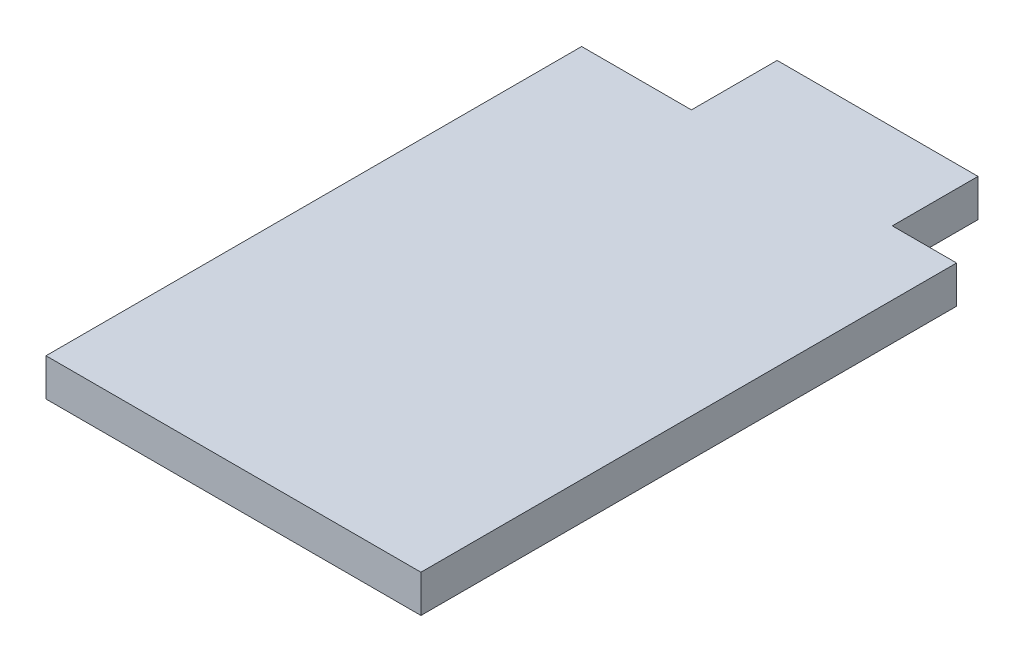
ISO-10303-21;
HEADER;
FILE_DESCRIPTION(('STEP AP214'),'2;1');
FILE_NAME('part.step','',(''),(''),'','','');
FILE_SCHEMA(('AUTOMOTIVE_DESIGN { 1 0 10303 214 1 1 1 1 }'));
ENDSEC;
DATA;
#1=APPLICATION_CONTEXT('core data for automotive mechanical design processes');
#2=APPLICATION_PROTOCOL_DEFINITION('international standard','automotive_design',2000,#1);
#3=PRODUCT_CONTEXT('',#1,'mechanical');
#4=PRODUCT('Part','Part','',(#3));
#5=PRODUCT_RELATED_PRODUCT_CATEGORY('part','',(#4));
#6=PRODUCT_DEFINITION_FORMATION('','',#4);
#7=PRODUCT_DEFINITION_CONTEXT('part definition',#1,'design');
#8=PRODUCT_DEFINITION('design','',#6,#7);
#9=PRODUCT_DEFINITION_SHAPE('','',#8);
#10=(LENGTH_UNIT() NAMED_UNIT(*) SI_UNIT(.MILLI.,.METRE.));
#11=(NAMED_UNIT(*) PLANE_ANGLE_UNIT() SI_UNIT($,.RADIAN.));
#12=(NAMED_UNIT(*) SI_UNIT($,.STERADIAN.) SOLID_ANGLE_UNIT());
#13=UNCERTAINTY_MEASURE_WITH_UNIT(LENGTH_MEASURE(1.E-05),#10,'distance_accuracy_value','');
#14=(GEOMETRIC_REPRESENTATION_CONTEXT(3) GLOBAL_UNCERTAINTY_ASSIGNED_CONTEXT((#13)) GLOBAL_UNIT_ASSIGNED_CONTEXT((#10,
#11,#12)) REPRESENTATION_CONTEXT('',''));
#15=CARTESIAN_POINT('',(0.,0.,0.));
#16=DIRECTION('',(0.,0.,1.));
#17=DIRECTION('',(1.,0.,0.));
#18=AXIS2_PLACEMENT_3D('',#15,#16,#17);
#19=CARTESIAN_POINT('',(-35.,7.,-50.));
#20=DIRECTION('',(0.,0.,1.));
#21=DIRECTION('',(1.,0.,0.));
#22=AXIS2_PLACEMENT_3D('',#19,#20,#21);
#23=PLANE('',#22);
#24=DIRECTION('',(0.,-1.,0.));
#25=VECTOR('',#24,1.);
#26=CARTESIAN_POINT('',(23.,7.,-50.));
#27=LINE('',#26,#25);
#28=CARTESIAN_POINT('',(23.,7.,-50.));
#29=VERTEX_POINT('',#28);
#30=CARTESIAN_POINT('',(23.,0.,-50.));
#31=VERTEX_POINT('',#30);
#32=EDGE_CURVE('E135',#29,#31,#27,.T.);
#33=ORIENTED_EDGE('',*,*,#32,.F.);
#34=DIRECTION('',(-1.,0.,0.));
#35=VECTOR('',#34,1.);
#36=CARTESIAN_POINT('',(-35.,7.,-50.));
#37=LINE('',#36,#35);
#38=CARTESIAN_POINT('',(35.,7.,-50.));
#39=VERTEX_POINT('',#38);
#40=EDGE_CURVE('E85',#39,#29,#37,.T.);
#41=ORIENTED_EDGE('',*,*,#40,.F.);
#42=DIRECTION('',(0.,-1.,0.));
#43=VECTOR('',#42,1.);
#44=CARTESIAN_POINT('',(35.,7.,-50.));
#45=LINE('',#44,#43);
#46=CARTESIAN_POINT('',(35.,0.,-50.));
#47=VERTEX_POINT('',#46);
#48=EDGE_CURVE('E11',#39,#47,#45,.T.);
#49=ORIENTED_EDGE('',*,*,#48,.T.);
#50=DIRECTION('',(-1.,0.,0.));
#51=VECTOR('',#50,1.);
#52=CARTESIAN_POINT('',(-35.,0.,-50.));
#53=LINE('',#52,#51);
#54=EDGE_CURVE('E184',#47,#31,#53,.T.);
#55=ORIENTED_EDGE('',*,*,#54,.T.);
#56=EDGE_LOOP('',(#33,#41,#49,#55));
#57=FACE_BOUND('',#56,.T.);
#58=ADVANCED_FACE('F31',(#57),#23,.F.);
#59=CARTESIAN_POINT('',(35.,7.,50.));
#60=DIRECTION('',(-1.,0.,0.));
#61=DIRECTION('',(0.,0.,1.));
#62=AXIS2_PLACEMENT_3D('',#59,#60,#61);
#63=PLANE('',#62);
#64=DIRECTION('',(0.,0.,-1.));
#65=VECTOR('',#64,1.);
#66=CARTESIAN_POINT('',(35.,0.,50.));
#67=LINE('',#66,#65);
#68=CARTESIAN_POINT('',(35.,0.,50.));
#69=VERTEX_POINT('',#68);
#70=EDGE_CURVE('E166',#69,#47,#67,.T.);
#71=ORIENTED_EDGE('',*,*,#70,.T.);
#72=ORIENTED_EDGE('',*,*,#48,.F.);
#73=DIRECTION('',(0.,0.,-1.));
#74=VECTOR('',#73,1.);
#75=CARTESIAN_POINT('',(35.,7.,50.));
#76=LINE('',#75,#74);
#77=CARTESIAN_POINT('',(35.,7.,50.));
#78=VERTEX_POINT('',#77);
#79=EDGE_CURVE('E169',#78,#39,#76,.T.);
#80=ORIENTED_EDGE('',*,*,#79,.F.);
#81=DIRECTION('',(0.,-1.,0.));
#82=VECTOR('',#81,1.);
#83=CARTESIAN_POINT('',(35.,7.,50.));
#84=LINE('',#83,#82);
#85=EDGE_CURVE('E192',#78,#69,#84,.T.);
#86=ORIENTED_EDGE('',*,*,#85,.T.);
#87=EDGE_LOOP('',(#71,#72,#80,#86));
#88=FACE_BOUND('',#87,.T.);
#89=ADVANCED_FACE('F33',(#88),#63,.F.);
#90=CARTESIAN_POINT('',(-14.5,7.,-50.));
#91=VERTEX_POINT('',#90);
#92=CARTESIAN_POINT('',(-35.,7.,-50.));
#93=VERTEX_POINT('',#92);
#94=EDGE_CURVE('E171',#91,#93,#37,.T.);
#95=ORIENTED_EDGE('',*,*,#94,.F.);
#96=DIRECTION('',(0.,-1.,0.));
#97=VECTOR('',#96,1.);
#98=CARTESIAN_POINT('',(-14.5,7.,-50.));
#99=LINE('',#98,#97);
#100=CARTESIAN_POINT('',(-14.5,0.,-50.));
#101=VERTEX_POINT('',#100);
#102=EDGE_CURVE('E125',#91,#101,#99,.T.);
#103=ORIENTED_EDGE('',*,*,#102,.T.);
#104=CARTESIAN_POINT('',(-35.,0.,-50.));
#105=VERTEX_POINT('',#104);
#106=EDGE_CURVE('E181',#101,#105,#53,.T.);
#107=ORIENTED_EDGE('',*,*,#106,.T.);
#108=DIRECTION('',(0.,-1.,0.));
#109=VECTOR('',#108,1.);
#110=CARTESIAN_POINT('',(-35.,7.,-50.));
#111=LINE('',#110,#109);
#112=EDGE_CURVE('E40',#93,#105,#111,.T.);
#113=ORIENTED_EDGE('',*,*,#112,.F.);
#114=EDGE_LOOP('',(#95,#103,#107,#113));
#115=FACE_BOUND('',#114,.T.);
#116=ADVANCED_FACE('F214',(#115),#23,.F.);
#117=CARTESIAN_POINT('',(-35.,7.,50.));
#118=DIRECTION('',(1.,0.,0.));
#119=DIRECTION('',(0.,0.,-1.));
#120=AXIS2_PLACEMENT_3D('',#117,#118,#119);
#121=PLANE('',#120);
#122=DIRECTION('',(0.,0.,1.));
#123=VECTOR('',#122,1.);
#124=CARTESIAN_POINT('',(-35.,0.,50.));
#125=LINE('',#124,#123);
#126=CARTESIAN_POINT('',(-35.,0.,50.));
#127=VERTEX_POINT('',#126);
#128=EDGE_CURVE('E188',#105,#127,#125,.T.);
#129=ORIENTED_EDGE('',*,*,#128,.T.);
#130=DIRECTION('',(0.,-1.,0.));
#131=VECTOR('',#130,1.);
#132=CARTESIAN_POINT('',(-35.,7.,50.));
#133=LINE('',#132,#131);
#134=CARTESIAN_POINT('',(-35.,7.,50.));
#135=VERTEX_POINT('',#134);
#136=EDGE_CURVE('E194',#135,#127,#133,.T.);
#137=ORIENTED_EDGE('',*,*,#136,.F.);
#138=DIRECTION('',(0.,0.,1.));
#139=VECTOR('',#138,1.);
#140=CARTESIAN_POINT('',(-35.,7.,50.));
#141=LINE('',#140,#139);
#142=EDGE_CURVE('E174',#93,#135,#141,.T.);
#143=ORIENTED_EDGE('',*,*,#142,.F.);
#144=ORIENTED_EDGE('',*,*,#112,.T.);
#145=EDGE_LOOP('',(#129,#137,#143,#144));
#146=FACE_BOUND('',#145,.T.);
#147=ADVANCED_FACE('F201',(#146),#121,.F.);
#148=CARTESIAN_POINT('',(-35.,7.,50.));
#149=DIRECTION('',(0.,0.,-1.));
#150=DIRECTION('',(-1.,0.,0.));
#151=AXIS2_PLACEMENT_3D('',#148,#149,#150);
#152=PLANE('',#151);
#153=DIRECTION('',(1.,0.,0.));
#154=VECTOR('',#153,1.);
#155=CARTESIAN_POINT('',(-35.,0.,50.));
#156=LINE('',#155,#154);
#157=EDGE_CURVE('E78',#127,#69,#156,.T.);
#158=ORIENTED_EDGE('',*,*,#157,.T.);
#159=ORIENTED_EDGE('',*,*,#85,.F.);
#160=DIRECTION('',(1.,0.,0.));
#161=VECTOR('',#160,1.);
#162=CARTESIAN_POINT('',(-35.,7.,50.));
#163=LINE('',#162,#161);
#164=EDGE_CURVE('E57',#135,#78,#163,.T.);
#165=ORIENTED_EDGE('',*,*,#164,.F.);
#166=ORIENTED_EDGE('',*,*,#136,.T.);
#167=EDGE_LOOP('',(#158,#159,#165,#166));
#168=FACE_BOUND('',#167,.T.);
#169=ADVANCED_FACE('F213',(#168),#152,.F.);
#170=CARTESIAN_POINT('',(35.,7.,-50.));
#171=DIRECTION('',(0.,-1.,0.));
#172=DIRECTION('',(0.,0.,-1.));
#173=AXIS2_PLACEMENT_3D('',#170,#171,#172);
#174=PLANE('',#173);
#175=ORIENTED_EDGE('',*,*,#79,.T.);
#176=ORIENTED_EDGE('',*,*,#40,.T.);
#177=DIRECTION('',(0.,0.,1.));
#178=VECTOR('',#177,1.);
#179=CARTESIAN_POINT('',(23.,7.,-50.));
#180=LINE('',#179,#178);
#181=CARTESIAN_POINT('',(23.,7.,-66.));
#182=VERTEX_POINT('',#181);
#183=EDGE_CURVE('E116',#182,#29,#180,.T.);
#184=ORIENTED_EDGE('',*,*,#183,.F.);
#185=DIRECTION('',(1.,0.,0.));
#186=VECTOR('',#185,1.);
#187=CARTESIAN_POINT('',(-14.5,7.,-66.));
#188=LINE('',#187,#186);
#189=CARTESIAN_POINT('',(-14.5,7.,-66.));
#190=VERTEX_POINT('',#189);
#191=EDGE_CURVE('E111',#190,#182,#188,.T.);
#192=ORIENTED_EDGE('',*,*,#191,.F.);
#193=DIRECTION('',(0.,0.,-1.));
#194=VECTOR('',#193,1.);
#195=CARTESIAN_POINT('',(-14.5,7.,-50.));
#196=LINE('',#195,#194);
#197=EDGE_CURVE('E121',#91,#190,#196,.T.);
#198=ORIENTED_EDGE('',*,*,#197,.F.);
#199=ORIENTED_EDGE('',*,*,#94,.T.);
#200=ORIENTED_EDGE('',*,*,#142,.T.);
#201=ORIENTED_EDGE('',*,*,#164,.T.);
#202=EDGE_LOOP('',(#175,#176,#184,#192,#198,#199,#200,#201));
#203=FACE_BOUND('',#202,.T.);
#204=ADVANCED_FACE('F120',(#203),#174,.F.);
#205=CARTESIAN_POINT('',(35.,0.,-50.));
#206=DIRECTION('',(0.,-1.,0.));
#207=DIRECTION('',(0.,0.,-1.));
#208=AXIS2_PLACEMENT_3D('',#205,#206,#207);
#209=PLANE('',#208);
#210=CARTESIAN_POINT('',(30.5,0.,-36.5));
#211=DIRECTION('',(0.,-1.,0.));
#212=DIRECTION('',(0.,0.,-1.));
#213=AXIS2_PLACEMENT_3D('',#210,#211,#212);
#214=CIRCLE('',#213,1.5);
#215=CARTESIAN_POINT('',(30.5,0.,-38.));
#216=VERTEX_POINT('',#215);
#217=EDGE_CURVE('E148',#216,#216,#214,.T.);
#218=ORIENTED_EDGE('',*,*,#217,.F.);
#219=EDGE_LOOP('',(#218));
#220=FACE_BOUND('',#219,.T.);
#221=CARTESIAN_POINT('',(30.5,0.,39.5));
#222=DIRECTION('',(0.,-1.,0.));
#223=DIRECTION('',(0.,0.,-1.));
#224=AXIS2_PLACEMENT_3D('',#221,#222,#223);
#225=CIRCLE('',#224,1.5);
#226=CARTESIAN_POINT('',(30.5,0.,38.));
#227=VERTEX_POINT('',#226);
#228=EDGE_CURVE('E147',#227,#227,#225,.T.);
#229=ORIENTED_EDGE('',*,*,#228,.F.);
#230=EDGE_LOOP('',(#229));
#231=FACE_BOUND('',#230,.T.);
#232=CARTESIAN_POINT('',(-30.5,0.,39.5));
#233=DIRECTION('',(0.,-1.,0.));
#234=DIRECTION('',(0.,0.,-1.));
#235=AXIS2_PLACEMENT_3D('',#232,#233,#234);
#236=CIRCLE('',#235,1.5);
#237=CARTESIAN_POINT('',(-30.5,0.,38.));
#238=VERTEX_POINT('',#237);
#239=EDGE_CURVE('E154',#238,#238,#236,.T.);
#240=ORIENTED_EDGE('',*,*,#239,.F.);
#241=EDGE_LOOP('',(#240));
#242=FACE_BOUND('',#241,.T.);
#243=CARTESIAN_POINT('',(-30.5,0.,-36.5));
#244=DIRECTION('',(0.,-1.,0.));
#245=DIRECTION('',(0.,0.,-1.));
#246=AXIS2_PLACEMENT_3D('',#243,#244,#245);
#247=CIRCLE('',#246,1.5);
#248=CARTESIAN_POINT('',(-30.5,0.,-38.));
#249=VERTEX_POINT('',#248);
#250=EDGE_CURVE('E160',#249,#249,#247,.T.);
#251=ORIENTED_EDGE('',*,*,#250,.F.);
#252=EDGE_LOOP('',(#251));
#253=FACE_BOUND('',#252,.T.);
#254=ORIENTED_EDGE('',*,*,#70,.F.);
#255=ORIENTED_EDGE('',*,*,#157,.F.);
#256=ORIENTED_EDGE('',*,*,#128,.F.);
#257=ORIENTED_EDGE('',*,*,#106,.F.);
#258=DIRECTION('',(0.,0.,-1.));
#259=VECTOR('',#258,1.);
#260=CARTESIAN_POINT('',(-14.5,0.,-50.));
#261=LINE('',#260,#259);
#262=CARTESIAN_POINT('',(-14.5,0.,-66.));
#263=VERTEX_POINT('',#262);
#264=EDGE_CURVE('E48',#101,#263,#261,.T.);
#265=ORIENTED_EDGE('',*,*,#264,.T.);
#266=DIRECTION('',(1.,0.,0.));
#267=VECTOR('',#266,1.);
#268=CARTESIAN_POINT('',(-14.5,0.,-66.));
#269=LINE('',#268,#267);
#270=CARTESIAN_POINT('',(23.,0.,-66.));
#271=VERTEX_POINT('',#270);
#272=EDGE_CURVE('E113',#263,#271,#269,.T.);
#273=ORIENTED_EDGE('',*,*,#272,.T.);
#274=DIRECTION('',(0.,0.,1.));
#275=VECTOR('',#274,1.);
#276=CARTESIAN_POINT('',(23.,0.,-50.));
#277=LINE('',#276,#275);
#278=EDGE_CURVE('E126',#271,#31,#277,.T.);
#279=ORIENTED_EDGE('',*,*,#278,.T.);
#280=ORIENTED_EDGE('',*,*,#54,.F.);
#281=EDGE_LOOP('',(#254,#255,#256,#257,#265,#273,#279,#280));
#282=FACE_BOUND('',#281,.T.);
#283=ADVANCED_FACE('F207',(#220,#231,#242,#253,#282),#209,.T.);
#284=CARTESIAN_POINT('',(-30.5,5.,-36.5));
#285=DIRECTION('',(0.,-1.,0.));
#286=DIRECTION('',(0.,0.,-1.));
#287=AXIS2_PLACEMENT_3D('',#284,#285,#286);
#288=CYLINDRICAL_SURFACE('',#287,1.5);
#289=CARTESIAN_POINT('',(-30.5,5.,-36.5));
#290=DIRECTION('',(0.,-1.,0.));
#291=DIRECTION('',(0.,0.,-1.));
#292=AXIS2_PLACEMENT_3D('',#289,#290,#291);
#293=CIRCLE('',#292,1.5);
#294=CARTESIAN_POINT('',(-30.5,5.,-38.));
#295=VERTEX_POINT('',#294);
#296=EDGE_CURVE('E163',#295,#295,#293,.T.);
#297=ORIENTED_EDGE('',*,*,#296,.F.);
#298=EDGE_LOOP('',(#297));
#299=FACE_BOUND('',#298,.T.);
#300=ORIENTED_EDGE('',*,*,#250,.T.);
#301=EDGE_LOOP('',(#300));
#302=FACE_BOUND('',#301,.T.);
#303=ADVANCED_FACE('F266',(#299,#302),#288,.F.);
#304=CARTESIAN_POINT('',(-30.5,5.,-36.5));
#305=DIRECTION('',(0.,-1.,0.));
#306=DIRECTION('',(0.,0.,-1.));
#307=AXIS2_PLACEMENT_3D('',#304,#305,#306);
#308=PLANE('',#307);
#309=ORIENTED_EDGE('',*,*,#296,.T.);
#310=EDGE_LOOP('',(#309));
#311=FACE_BOUND('',#310,.T.);
#312=ADVANCED_FACE('F262',(#311),#308,.T.);
#313=CARTESIAN_POINT('',(-30.5,5.,39.5));
#314=DIRECTION('',(0.,-1.,0.));
#315=DIRECTION('',(0.,0.,-1.));
#316=AXIS2_PLACEMENT_3D('',#313,#314,#315);
#317=CYLINDRICAL_SURFACE('',#316,1.5);
#318=CARTESIAN_POINT('',(-30.5,5.,39.5));
#319=DIRECTION('',(0.,-1.,0.));
#320=DIRECTION('',(0.,0.,-1.));
#321=AXIS2_PLACEMENT_3D('',#318,#319,#320);
#322=CIRCLE('',#321,1.5);
#323=CARTESIAN_POINT('',(-30.5,5.,38.));
#324=VERTEX_POINT('',#323);
#325=EDGE_CURVE('E157',#324,#324,#322,.T.);
#326=ORIENTED_EDGE('',*,*,#325,.F.);
#327=EDGE_LOOP('',(#326));
#328=FACE_BOUND('',#327,.T.);
#329=ORIENTED_EDGE('',*,*,#239,.T.);
#330=EDGE_LOOP('',(#329));
#331=FACE_BOUND('',#330,.T.);
#332=ADVANCED_FACE('F258',(#328,#331),#317,.F.);
#333=CARTESIAN_POINT('',(-30.5,5.,39.5));
#334=DIRECTION('',(0.,-1.,0.));
#335=DIRECTION('',(0.,0.,-1.));
#336=AXIS2_PLACEMENT_3D('',#333,#334,#335);
#337=PLANE('',#336);
#338=ORIENTED_EDGE('',*,*,#325,.T.);
#339=EDGE_LOOP('',(#338));
#340=FACE_BOUND('',#339,.T.);
#341=ADVANCED_FACE('F254',(#340),#337,.T.);
#342=CARTESIAN_POINT('',(30.5,5.,39.5));
#343=DIRECTION('',(0.,-1.,0.));
#344=DIRECTION('',(0.,0.,-1.));
#345=AXIS2_PLACEMENT_3D('',#342,#343,#344);
#346=CYLINDRICAL_SURFACE('',#345,1.5);
#347=CARTESIAN_POINT('',(30.5,5.,39.5));
#348=DIRECTION('',(0.,-1.,0.));
#349=DIRECTION('',(0.,0.,-1.));
#350=AXIS2_PLACEMENT_3D('',#347,#348,#349);
#351=CIRCLE('',#350,1.5);
#352=CARTESIAN_POINT('',(30.5,5.,38.));
#353=VERTEX_POINT('',#352);
#354=EDGE_CURVE('E151',#353,#353,#351,.T.);
#355=ORIENTED_EDGE('',*,*,#354,.F.);
#356=EDGE_LOOP('',(#355));
#357=FACE_BOUND('',#356,.T.);
#358=ORIENTED_EDGE('',*,*,#228,.T.);
#359=EDGE_LOOP('',(#358));
#360=FACE_BOUND('',#359,.T.);
#361=ADVANCED_FACE('F250',(#357,#360),#346,.F.);
#362=CARTESIAN_POINT('',(30.5,5.,39.5));
#363=DIRECTION('',(0.,-1.,0.));
#364=DIRECTION('',(0.,0.,-1.));
#365=AXIS2_PLACEMENT_3D('',#362,#363,#364);
#366=PLANE('',#365);
#367=ORIENTED_EDGE('',*,*,#354,.T.);
#368=EDGE_LOOP('',(#367));
#369=FACE_BOUND('',#368,.T.);
#370=ADVANCED_FACE('F246',(#369),#366,.T.);
#371=CARTESIAN_POINT('',(30.5,5.,-36.5));
#372=DIRECTION('',(0.,-1.,0.));
#373=DIRECTION('',(0.,0.,-1.));
#374=AXIS2_PLACEMENT_3D('',#371,#372,#373);
#375=CYLINDRICAL_SURFACE('',#374,1.5);
#376=CARTESIAN_POINT('',(30.5,5.,-36.5));
#377=DIRECTION('',(0.,-1.,0.));
#378=DIRECTION('',(0.,0.,-1.));
#379=AXIS2_PLACEMENT_3D('',#376,#377,#378);
#380=CIRCLE('',#379,1.5);
#381=CARTESIAN_POINT('',(30.5,5.,-38.));
#382=VERTEX_POINT('',#381);
#383=EDGE_CURVE('E144',#382,#382,#380,.T.);
#384=ORIENTED_EDGE('',*,*,#383,.F.);
#385=EDGE_LOOP('',(#384));
#386=FACE_BOUND('',#385,.T.);
#387=ORIENTED_EDGE('',*,*,#217,.T.);
#388=EDGE_LOOP('',(#387));
#389=FACE_BOUND('',#388,.T.);
#390=ADVANCED_FACE('F242',(#386,#389),#375,.F.);
#391=CARTESIAN_POINT('',(30.5,5.,-36.5));
#392=DIRECTION('',(0.,-1.,0.));
#393=DIRECTION('',(0.,0.,-1.));
#394=AXIS2_PLACEMENT_3D('',#391,#392,#393);
#395=PLANE('',#394);
#396=ORIENTED_EDGE('',*,*,#383,.T.);
#397=EDGE_LOOP('',(#396));
#398=FACE_BOUND('',#397,.T.);
#399=ADVANCED_FACE('F237',(#398),#395,.T.);
#400=CARTESIAN_POINT('',(-14.5,7.,-50.));
#401=DIRECTION('',(-1.,0.,0.));
#402=DIRECTION('',(0.,0.,1.));
#403=AXIS2_PLACEMENT_3D('',#400,#401,#402);
#404=PLANE('',#403);
#405=ORIENTED_EDGE('',*,*,#264,.F.);
#406=ORIENTED_EDGE('',*,*,#102,.F.);
#407=ORIENTED_EDGE('',*,*,#197,.T.);
#408=DIRECTION('',(0.,-1.,0.));
#409=VECTOR('',#408,1.);
#410=CARTESIAN_POINT('',(-14.5,7.,-66.));
#411=LINE('',#410,#409);
#412=EDGE_CURVE('E108',#190,#263,#411,.T.);
#413=ORIENTED_EDGE('',*,*,#412,.T.);
#414=EDGE_LOOP('',(#405,#406,#407,#413));
#415=FACE_BOUND('',#414,.T.);
#416=ADVANCED_FACE('F124',(#415),#404,.T.);
#417=CARTESIAN_POINT('',(23.,7.,-50.));
#418=DIRECTION('',(1.,0.,0.));
#419=DIRECTION('',(0.,0.,-1.));
#420=AXIS2_PLACEMENT_3D('',#417,#418,#419);
#421=PLANE('',#420);
#422=ORIENTED_EDGE('',*,*,#278,.F.);
#423=DIRECTION('',(0.,-1.,0.));
#424=VECTOR('',#423,1.);
#425=CARTESIAN_POINT('',(23.,7.,-66.));
#426=LINE('',#425,#424);
#427=EDGE_CURVE('E115',#182,#271,#426,.T.);
#428=ORIENTED_EDGE('',*,*,#427,.F.);
#429=ORIENTED_EDGE('',*,*,#183,.T.);
#430=ORIENTED_EDGE('',*,*,#32,.T.);
#431=EDGE_LOOP('',(#422,#428,#429,#430));
#432=FACE_BOUND('',#431,.T.);
#433=ADVANCED_FACE('F228',(#432),#421,.T.);
#434=CARTESIAN_POINT('',(-14.5,7.,-66.));
#435=DIRECTION('',(0.,0.,-1.));
#436=DIRECTION('',(-1.,0.,0.));
#437=AXIS2_PLACEMENT_3D('',#434,#435,#436);
#438=PLANE('',#437);
#439=ORIENTED_EDGE('',*,*,#272,.F.);
#440=ORIENTED_EDGE('',*,*,#412,.F.);
#441=ORIENTED_EDGE('',*,*,#191,.T.);
#442=ORIENTED_EDGE('',*,*,#427,.T.);
#443=EDGE_LOOP('',(#439,#440,#441,#442));
#444=FACE_BOUND('',#443,.T.);
#445=ADVANCED_FACE('F110',(#444),#438,.T.);
#446=CLOSED_SHELL('',(#58,#89,#116,#147,#169,#204,#283,#303,#312,#332,#341,#361,#370,#390,#399,
#416,#433,#445));
#447=MANIFOLD_SOLID_BREP('B2',#446);
#448=ADVANCED_BREP_SHAPE_REPRESENTATION('',(#18,#447),#14);
#449=SHAPE_DEFINITION_REPRESENTATION(#9,#448);
ENDSEC;
END-ISO-10303-21;
